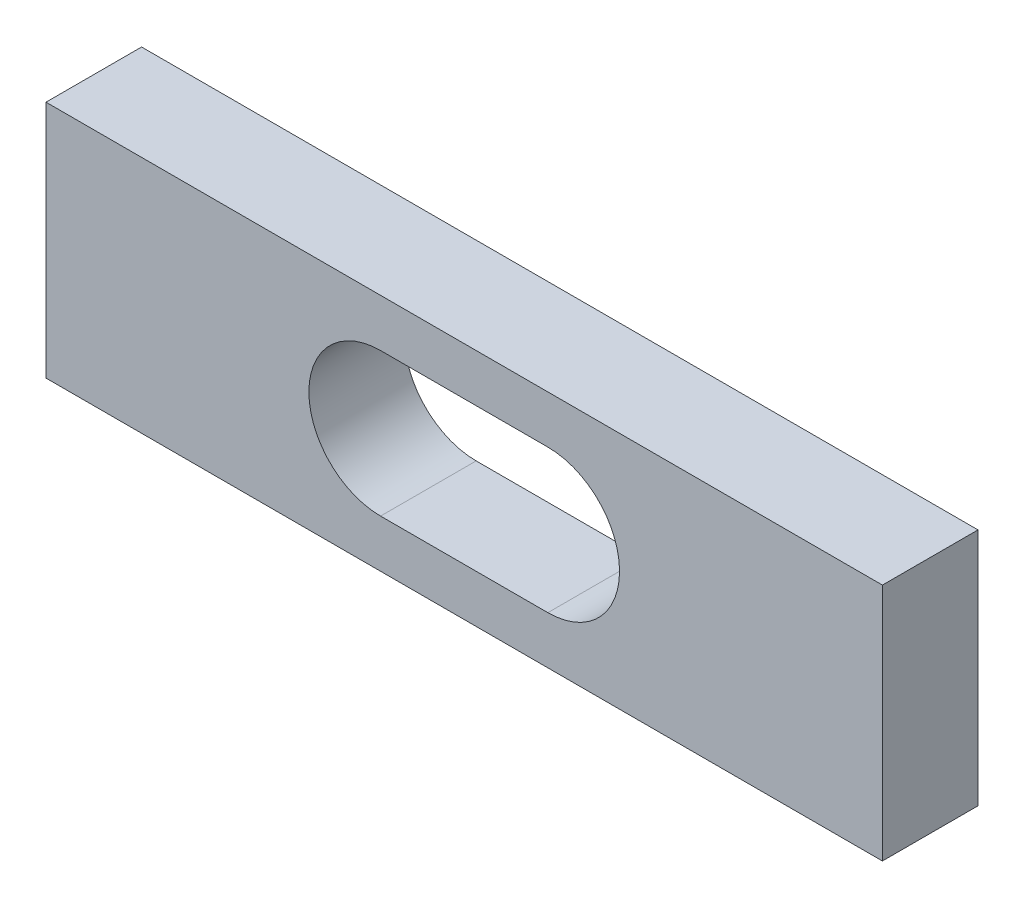
ISO-10303-21;
HEADER;
FILE_DESCRIPTION(('STEP AP214'),'2;1');
FILE_NAME('part.step','',(''),(''),'','','');
FILE_SCHEMA(('AUTOMOTIVE_DESIGN { 1 0 10303 214 1 1 1 1 }'));
ENDSEC;
DATA;
#1=APPLICATION_CONTEXT('core data for automotive mechanical design processes');
#2=APPLICATION_PROTOCOL_DEFINITION('international standard','automotive_design',2000,#1);
#3=PRODUCT_CONTEXT('',#1,'mechanical');
#4=PRODUCT('Part','Part','',(#3));
#5=PRODUCT_RELATED_PRODUCT_CATEGORY('part','',(#4));
#6=PRODUCT_DEFINITION_FORMATION('','',#4);
#7=PRODUCT_DEFINITION_CONTEXT('part definition',#1,'design');
#8=PRODUCT_DEFINITION('design','',#6,#7);
#9=PRODUCT_DEFINITION_SHAPE('','',#8);
#10=(LENGTH_UNIT() NAMED_UNIT(*) SI_UNIT(.MILLI.,.METRE.));
#11=(NAMED_UNIT(*) PLANE_ANGLE_UNIT() SI_UNIT($,.RADIAN.));
#12=(NAMED_UNIT(*) SI_UNIT($,.STERADIAN.) SOLID_ANGLE_UNIT());
#13=UNCERTAINTY_MEASURE_WITH_UNIT(LENGTH_MEASURE(1.E-05),#10,'distance_accuracy_value','');
#14=(GEOMETRIC_REPRESENTATION_CONTEXT(3) GLOBAL_UNCERTAINTY_ASSIGNED_CONTEXT((#13)) GLOBAL_UNIT_ASSIGNED_CONTEXT((#10,
#11,#12)) REPRESENTATION_CONTEXT('',''));
#15=CARTESIAN_POINT('',(0.,0.,0.));
#16=DIRECTION('',(0.,0.,1.));
#17=DIRECTION('',(1.,0.,0.));
#18=AXIS2_PLACEMENT_3D('',#15,#16,#17);
#19=CARTESIAN_POINT('',(0.,0.,0.));
#20=DIRECTION('',(0.,0.,1.));
#21=DIRECTION('',(1.,0.,0.));
#22=AXIS2_PLACEMENT_3D('',#19,#20,#21);
#23=PLANE('',#22);
#24=CARTESIAN_POINT('',(29.5,5.,0.));
#25=DIRECTION('',(0.,0.,1.));
#26=DIRECTION('',(1.,0.,0.));
#27=AXIS2_PLACEMENT_3D('',#24,#25,#26);
#28=CIRCLE('',#27,2.5);
#29=CARTESIAN_POINT('',(32.,5.,0.));
#30=VERTEX_POINT('',#29);
#31=EDGE_CURVE('E109',#30,#30,#28,.T.);
#32=ORIENTED_EDGE('',*,*,#31,.T.);
#33=EDGE_LOOP('',(#32));
#34=FACE_BOUND('',#33,.T.);
#35=CARTESIAN_POINT('',(5.5,5.,0.));
#36=DIRECTION('',(0.,0.,1.));
#37=DIRECTION('',(1.,0.,0.));
#38=AXIS2_PLACEMENT_3D('',#35,#36,#37);
#39=CIRCLE('',#38,2.5);
#40=CARTESIAN_POINT('',(8.,5.,0.));
#41=VERTEX_POINT('',#40);
#42=EDGE_CURVE('E160',#41,#41,#39,.T.);
#43=ORIENTED_EDGE('',*,*,#42,.T.);
#44=EDGE_LOOP('',(#43));
#45=FACE_BOUND('',#44,.T.);
#46=DIRECTION('',(1.,0.,0.));
#47=VECTOR('',#46,1.);
#48=CARTESIAN_POINT('',(0.,0.,0.));
#49=LINE('',#48,#47);
#50=CARTESIAN_POINT('',(0.,0.,0.));
#51=VERTEX_POINT('',#50);
#52=CARTESIAN_POINT('',(35.,0.,0.));
#53=VERTEX_POINT('',#52);
#54=EDGE_CURVE('E163',#51,#53,#49,.T.);
#55=ORIENTED_EDGE('',*,*,#54,.F.);
#56=DIRECTION('',(0.,-1.,0.));
#57=VECTOR('',#56,1.);
#58=CARTESIAN_POINT('',(0.,0.,0.));
#59=LINE('',#58,#57);
#60=CARTESIAN_POINT('',(0.,10.,0.));
#61=VERTEX_POINT('',#60);
#62=EDGE_CURVE('E58',#61,#51,#59,.T.);
#63=ORIENTED_EDGE('',*,*,#62,.F.);
#64=DIRECTION('',(-1.,0.,0.));
#65=VECTOR('',#64,1.);
#66=CARTESIAN_POINT('',(0.,10.,0.));
#67=LINE('',#66,#65);
#68=CARTESIAN_POINT('',(35.,10.,0.));
#69=VERTEX_POINT('',#68);
#70=EDGE_CURVE('E168',#69,#61,#67,.T.);
#71=ORIENTED_EDGE('',*,*,#70,.F.);
#72=DIRECTION('',(0.,1.,0.));
#73=VECTOR('',#72,1.);
#74=CARTESIAN_POINT('',(35.,0.,0.));
#75=LINE('',#74,#73);
#76=EDGE_CURVE('E166',#53,#69,#75,.T.);
#77=ORIENTED_EDGE('',*,*,#76,.F.);
#78=EDGE_LOOP('',(#55,#63,#71,#77));
#79=FACE_BOUND('',#78,.T.);
#80=CARTESIAN_POINT('',(14.,5.,0.));
#81=DIRECTION('',(0.,0.,1.));
#82=DIRECTION('',(1.,0.,0.));
#83=AXIS2_PLACEMENT_3D('',#80,#81,#82);
#84=CIRCLE('',#83,3.);
#85=CARTESIAN_POINT('',(14.,8.,0.));
#86=VERTEX_POINT('',#85);
#87=CARTESIAN_POINT('',(14.,2.,0.));
#88=VERTEX_POINT('',#87);
#89=EDGE_CURVE('E50',#86,#88,#84,.T.);
#90=ORIENTED_EDGE('',*,*,#89,.T.);
#91=DIRECTION('',(1.,0.,0.));
#92=VECTOR('',#91,1.);
#93=CARTESIAN_POINT('',(14.,2.,0.));
#94=LINE('',#93,#92);
#95=CARTESIAN_POINT('',(21.,2.,0.));
#96=VERTEX_POINT('',#95);
#97=EDGE_CURVE('E108',#88,#96,#94,.T.);
#98=ORIENTED_EDGE('',*,*,#97,.T.);
#99=CARTESIAN_POINT('',(21.,5.,0.));
#100=DIRECTION('',(0.,0.,1.));
#101=DIRECTION('',(1.,0.,0.));
#102=AXIS2_PLACEMENT_3D('',#99,#100,#101);
#103=CIRCLE('',#102,3.);
#104=CARTESIAN_POINT('',(21.,8.,0.));
#105=VERTEX_POINT('',#104);
#106=EDGE_CURVE('E148',#96,#105,#103,.T.);
#107=ORIENTED_EDGE('',*,*,#106,.T.);
#108=DIRECTION('',(-1.,0.,0.));
#109=VECTOR('',#108,1.);
#110=CARTESIAN_POINT('',(14.,8.,0.));
#111=LINE('',#110,#109);
#112=EDGE_CURVE('E151',#105,#86,#111,.T.);
#113=ORIENTED_EDGE('',*,*,#112,.T.);
#114=EDGE_LOOP('',(#90,#98,#107,#113));
#115=FACE_BOUND('',#114,.T.);
#116=ADVANCED_FACE('F35',(#34,#45,#79,#115),#23,.F.);
#117=CARTESIAN_POINT('',(0.,0.,2.));
#118=DIRECTION('',(0.,1.,0.));
#119=DIRECTION('',(0.,0.,1.));
#120=AXIS2_PLACEMENT_3D('',#117,#118,#119);
#121=PLANE('',#120);
#122=ORIENTED_EDGE('',*,*,#54,.T.);
#123=DIRECTION('',(0.,0.,-1.));
#124=VECTOR('',#123,1.);
#125=CARTESIAN_POINT('',(35.,0.,2.));
#126=LINE('',#125,#124);
#127=CARTESIAN_POINT('',(35.,0.,4.));
#128=VERTEX_POINT('',#127);
#129=EDGE_CURVE('E11',#128,#53,#126,.T.);
#130=ORIENTED_EDGE('',*,*,#129,.F.);
#131=DIRECTION('',(1.,0.,0.));
#132=VECTOR('',#131,1.);
#133=CARTESIAN_POINT('',(0.,0.,4.));
#134=LINE('',#133,#132);
#135=CARTESIAN_POINT('',(0.,0.,4.));
#136=VERTEX_POINT('',#135);
#137=EDGE_CURVE('E131',#136,#128,#134,.T.);
#138=ORIENTED_EDGE('',*,*,#137,.F.);
#139=DIRECTION('',(0.,0.,-1.));
#140=VECTOR('',#139,1.);
#141=CARTESIAN_POINT('',(0.,0.,2.));
#142=LINE('',#141,#140);
#143=EDGE_CURVE('E171',#136,#51,#142,.T.);
#144=ORIENTED_EDGE('',*,*,#143,.T.);
#145=EDGE_LOOP('',(#122,#130,#138,#144));
#146=FACE_BOUND('',#145,.T.);
#147=ADVANCED_FACE('F37',(#146),#121,.F.);
#148=CARTESIAN_POINT('',(35.,0.,2.));
#149=DIRECTION('',(-1.,0.,0.));
#150=DIRECTION('',(0.,0.,1.));
#151=AXIS2_PLACEMENT_3D('',#148,#149,#150);
#152=PLANE('',#151);
#153=ORIENTED_EDGE('',*,*,#76,.T.);
#154=DIRECTION('',(0.,0.,-1.));
#155=VECTOR('',#154,1.);
#156=CARTESIAN_POINT('',(35.,10.,2.));
#157=LINE('',#156,#155);
#158=CARTESIAN_POINT('',(35.,10.,4.));
#159=VERTEX_POINT('',#158);
#160=EDGE_CURVE('E43',#159,#69,#157,.T.);
#161=ORIENTED_EDGE('',*,*,#160,.F.);
#162=DIRECTION('',(0.,1.,0.));
#163=VECTOR('',#162,1.);
#164=CARTESIAN_POINT('',(35.,0.,4.));
#165=LINE('',#164,#163);
#166=EDGE_CURVE('E134',#128,#159,#165,.T.);
#167=ORIENTED_EDGE('',*,*,#166,.F.);
#168=ORIENTED_EDGE('',*,*,#129,.T.);
#169=EDGE_LOOP('',(#153,#161,#167,#168));
#170=FACE_BOUND('',#169,.T.);
#171=ADVANCED_FACE('F189',(#170),#152,.F.);
#172=CARTESIAN_POINT('',(0.,10.,2.));
#173=DIRECTION('',(0.,-1.,0.));
#174=DIRECTION('',(0.,0.,-1.));
#175=AXIS2_PLACEMENT_3D('',#172,#173,#174);
#176=PLANE('',#175);
#177=ORIENTED_EDGE('',*,*,#70,.T.);
#178=DIRECTION('',(0.,0.,-1.));
#179=VECTOR('',#178,1.);
#180=CARTESIAN_POINT('',(0.,10.,2.));
#181=LINE('',#180,#179);
#182=CARTESIAN_POINT('',(0.,10.,4.));
#183=VERTEX_POINT('',#182);
#184=EDGE_CURVE('E173',#183,#61,#181,.T.);
#185=ORIENTED_EDGE('',*,*,#184,.F.);
#186=DIRECTION('',(-1.,0.,0.));
#187=VECTOR('',#186,1.);
#188=CARTESIAN_POINT('',(0.,10.,4.));
#189=LINE('',#188,#187);
#190=EDGE_CURVE('E137',#159,#183,#189,.T.);
#191=ORIENTED_EDGE('',*,*,#190,.F.);
#192=ORIENTED_EDGE('',*,*,#160,.T.);
#193=EDGE_LOOP('',(#177,#185,#191,#192));
#194=FACE_BOUND('',#193,.T.);
#195=ADVANCED_FACE('F178',(#194),#176,.F.);
#196=CARTESIAN_POINT('',(0.,0.,2.));
#197=DIRECTION('',(1.,0.,0.));
#198=DIRECTION('',(0.,1.,0.));
#199=AXIS2_PLACEMENT_3D('',#196,#197,#198);
#200=PLANE('',#199);
#201=ORIENTED_EDGE('',*,*,#62,.T.);
#202=ORIENTED_EDGE('',*,*,#143,.F.);
#203=DIRECTION('',(0.,-1.,0.));
#204=VECTOR('',#203,1.);
#205=CARTESIAN_POINT('',(0.,0.,4.));
#206=LINE('',#205,#204);
#207=EDGE_CURVE('E128',#183,#136,#206,.T.);
#208=ORIENTED_EDGE('',*,*,#207,.F.);
#209=ORIENTED_EDGE('',*,*,#184,.T.);
#210=EDGE_LOOP('',(#201,#202,#208,#209));
#211=FACE_BOUND('',#210,.T.);
#212=ADVANCED_FACE('F187',(#211),#200,.F.);
#213=CARTESIAN_POINT('',(5.5,5.,2.));
#214=DIRECTION('',(0.,0.,-1.));
#215=DIRECTION('',(-1.,0.,0.));
#216=AXIS2_PLACEMENT_3D('',#213,#214,#215);
#217=CYLINDRICAL_SURFACE('',#216,2.5);
#218=CARTESIAN_POINT('',(5.5,5.,2.));
#219=DIRECTION('',(0.,0.,-1.));
#220=DIRECTION('',(-1.,0.,0.));
#221=AXIS2_PLACEMENT_3D('',#218,#219,#220);
#222=CIRCLE('',#221,2.5);
#223=CARTESIAN_POINT('',(3.,5.,2.));
#224=VERTEX_POINT('',#223);
#225=EDGE_CURVE('E143',#224,#224,#222,.T.);
#226=ORIENTED_EDGE('',*,*,#225,.F.);
#227=EDGE_LOOP('',(#226));
#228=FACE_BOUND('',#227,.T.);
#229=ORIENTED_EDGE('',*,*,#42,.F.);
#230=EDGE_LOOP('',(#229));
#231=FACE_BOUND('',#230,.T.);
#232=ADVANCED_FACE('F204',(#228,#231),#217,.F.);
#233=CARTESIAN_POINT('',(29.5,5.,2.));
#234=DIRECTION('',(0.,0.,-1.));
#235=DIRECTION('',(-1.,0.,0.));
#236=AXIS2_PLACEMENT_3D('',#233,#234,#235);
#237=CYLINDRICAL_SURFACE('',#236,2.5);
#238=CARTESIAN_POINT('',(29.5,5.,2.));
#239=DIRECTION('',(0.,0.,-1.));
#240=DIRECTION('',(-1.,0.,0.));
#241=AXIS2_PLACEMENT_3D('',#238,#239,#240);
#242=CIRCLE('',#241,2.5);
#243=CARTESIAN_POINT('',(27.,5.,2.));
#244=VERTEX_POINT('',#243);
#245=EDGE_CURVE('E140',#244,#244,#242,.T.);
#246=ORIENTED_EDGE('',*,*,#245,.F.);
#247=EDGE_LOOP('',(#246));
#248=FACE_BOUND('',#247,.T.);
#249=ORIENTED_EDGE('',*,*,#31,.F.);
#250=EDGE_LOOP('',(#249));
#251=FACE_BOUND('',#250,.T.);
#252=ADVANCED_FACE('F210',(#248,#251),#237,.F.);
#253=CARTESIAN_POINT('',(14.,5.,2.));
#254=DIRECTION('',(0.,0.,-1.));
#255=DIRECTION('',(-1.,0.,0.));
#256=AXIS2_PLACEMENT_3D('',#253,#254,#255);
#257=CYLINDRICAL_SURFACE('',#256,3.);
#258=ORIENTED_EDGE('',*,*,#89,.F.);
#259=DIRECTION('',(0.,0.,-1.));
#260=VECTOR('',#259,1.);
#261=CARTESIAN_POINT('',(14.,8.,2.));
#262=LINE('',#261,#260);
#263=CARTESIAN_POINT('',(14.,8.,4.));
#264=VERTEX_POINT('',#263);
#265=EDGE_CURVE('E115',#264,#86,#262,.T.);
#266=ORIENTED_EDGE('',*,*,#265,.F.);
#267=CARTESIAN_POINT('',(14.,5.,4.));
#268=DIRECTION('',(0.,0.,1.));
#269=DIRECTION('',(1.,0.,0.));
#270=AXIS2_PLACEMENT_3D('',#267,#268,#269);
#271=CIRCLE('',#270,3.);
#272=CARTESIAN_POINT('',(14.,2.,4.));
#273=VERTEX_POINT('',#272);
#274=EDGE_CURVE('E113',#264,#273,#271,.T.);
#275=ORIENTED_EDGE('',*,*,#274,.T.);
#276=DIRECTION('',(0.,0.,-1.));
#277=VECTOR('',#276,1.);
#278=CARTESIAN_POINT('',(14.,2.,2.));
#279=LINE('',#278,#277);
#280=EDGE_CURVE('E101',#273,#88,#279,.T.);
#281=ORIENTED_EDGE('',*,*,#280,.T.);
#282=EDGE_LOOP('',(#258,#266,#275,#281));
#283=FACE_BOUND('',#282,.T.);
#284=ADVANCED_FACE('F114',(#283),#257,.F.);
#285=CARTESIAN_POINT('',(14.,2.,2.));
#286=DIRECTION('',(0.,1.,0.));
#287=DIRECTION('',(-1.,0.,0.));
#288=AXIS2_PLACEMENT_3D('',#285,#286,#287);
#289=PLANE('',#288);
#290=ORIENTED_EDGE('',*,*,#97,.F.);
#291=ORIENTED_EDGE('',*,*,#280,.F.);
#292=DIRECTION('',(1.,0.,0.));
#293=VECTOR('',#292,1.);
#294=CARTESIAN_POINT('',(14.,2.,4.));
#295=LINE('',#294,#293);
#296=CARTESIAN_POINT('',(21.,2.,4.));
#297=VERTEX_POINT('',#296);
#298=EDGE_CURVE('E105',#273,#297,#295,.T.);
#299=ORIENTED_EDGE('',*,*,#298,.T.);
#300=DIRECTION('',(0.,0.,-1.));
#301=VECTOR('',#300,1.);
#302=CARTESIAN_POINT('',(21.,2.,2.));
#303=LINE('',#302,#301);
#304=EDGE_CURVE('E110',#297,#96,#303,.T.);
#305=ORIENTED_EDGE('',*,*,#304,.T.);
#306=EDGE_LOOP('',(#290,#291,#299,#305));
#307=FACE_BOUND('',#306,.T.);
#308=ADVANCED_FACE('F103',(#307),#289,.T.);
#309=CARTESIAN_POINT('',(21.,5.,2.));
#310=DIRECTION('',(0.,0.,-1.));
#311=DIRECTION('',(-1.,0.,0.));
#312=AXIS2_PLACEMENT_3D('',#309,#310,#311);
#313=CYLINDRICAL_SURFACE('',#312,3.);
#314=ORIENTED_EDGE('',*,*,#106,.F.);
#315=ORIENTED_EDGE('',*,*,#304,.F.);
#316=CARTESIAN_POINT('',(21.,5.,4.));
#317=DIRECTION('',(0.,0.,1.));
#318=DIRECTION('',(1.,0.,0.));
#319=AXIS2_PLACEMENT_3D('',#316,#317,#318);
#320=CIRCLE('',#319,3.);
#321=CARTESIAN_POINT('',(21.,8.,4.));
#322=VERTEX_POINT('',#321);
#323=EDGE_CURVE('E122',#297,#322,#320,.T.);
#324=ORIENTED_EDGE('',*,*,#323,.T.);
#325=DIRECTION('',(0.,0.,-1.));
#326=VECTOR('',#325,1.);
#327=CARTESIAN_POINT('',(21.,8.,2.));
#328=LINE('',#327,#326);
#329=EDGE_CURVE('E155',#322,#105,#328,.T.);
#330=ORIENTED_EDGE('',*,*,#329,.T.);
#331=EDGE_LOOP('',(#314,#315,#324,#330));
#332=FACE_BOUND('',#331,.T.);
#333=ADVANCED_FACE('F233',(#332),#313,.F.);
#334=CARTESIAN_POINT('',(14.,8.,2.));
#335=DIRECTION('',(0.,-1.,0.));
#336=DIRECTION('',(1.,0.,0.));
#337=AXIS2_PLACEMENT_3D('',#334,#335,#336);
#338=PLANE('',#337);
#339=ORIENTED_EDGE('',*,*,#112,.F.);
#340=ORIENTED_EDGE('',*,*,#329,.F.);
#341=DIRECTION('',(-1.,0.,0.));
#342=VECTOR('',#341,1.);
#343=CARTESIAN_POINT('',(14.,8.,4.));
#344=LINE('',#343,#342);
#345=EDGE_CURVE('E124',#322,#264,#344,.T.);
#346=ORIENTED_EDGE('',*,*,#345,.T.);
#347=ORIENTED_EDGE('',*,*,#265,.T.);
#348=EDGE_LOOP('',(#339,#340,#346,#347));
#349=FACE_BOUND('',#348,.T.);
#350=ADVANCED_FACE('F230',(#349),#338,.T.);
#351=CARTESIAN_POINT('',(0.,0.,4.));
#352=DIRECTION('',(0.,0.,-1.));
#353=DIRECTION('',(-1.,0.,0.));
#354=AXIS2_PLACEMENT_3D('',#351,#352,#353);
#355=PLANE('',#354);
#356=ORIENTED_EDGE('',*,*,#207,.T.);
#357=ORIENTED_EDGE('',*,*,#137,.T.);
#358=ORIENTED_EDGE('',*,*,#166,.T.);
#359=ORIENTED_EDGE('',*,*,#190,.T.);
#360=EDGE_LOOP('',(#356,#357,#358,#359));
#361=FACE_BOUND('',#360,.T.);
#362=ORIENTED_EDGE('',*,*,#274,.F.);
#363=ORIENTED_EDGE('',*,*,#345,.F.);
#364=ORIENTED_EDGE('',*,*,#323,.F.);
#365=ORIENTED_EDGE('',*,*,#298,.F.);
#366=EDGE_LOOP('',(#362,#363,#364,#365));
#367=FACE_BOUND('',#366,.T.);
#368=ADVANCED_FACE('F120',(#361,#367),#355,.F.);
#369=CARTESIAN_POINT('',(0.,0.,2.));
#370=DIRECTION('',(0.,0.,-1.));
#371=DIRECTION('',(-1.,0.,0.));
#372=AXIS2_PLACEMENT_3D('',#369,#370,#371);
#373=PLANE('',#372);
#374=ORIENTED_EDGE('',*,*,#245,.T.);
#375=EDGE_LOOP('',(#374));
#376=FACE_BOUND('',#375,.T.);
#377=ADVANCED_FACE('F222',(#376),#373,.T.);
#378=ORIENTED_EDGE('',*,*,#225,.T.);
#379=EDGE_LOOP('',(#378));
#380=FACE_BOUND('',#379,.T.);
#381=ADVANCED_FACE('F220',(#380),#373,.T.);
#382=CLOSED_SHELL('',(#116,#147,#171,#195,#212,#232,#252,#284,#308,#333,#350,#368,#377,#381));
#383=MANIFOLD_SOLID_BREP('B2',#382);
#384=ADVANCED_BREP_SHAPE_REPRESENTATION('',(#18,#383),#14);
#385=SHAPE_DEFINITION_REPRESENTATION(#9,#384);
ENDSEC;
END-ISO-10303-21;
